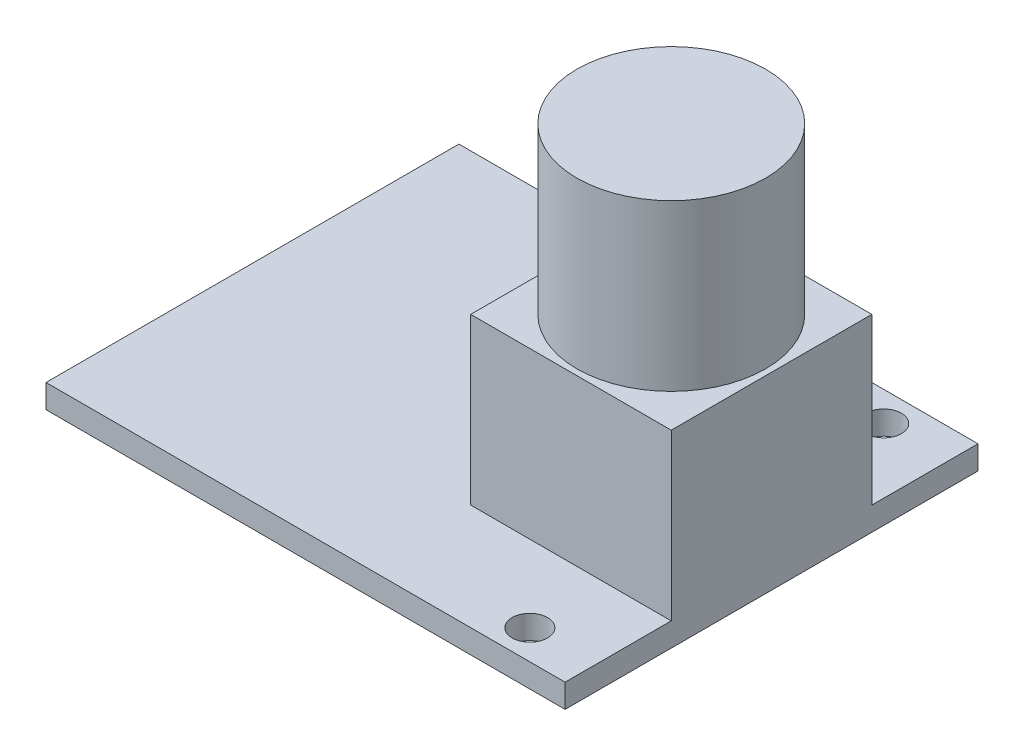
ISO-10303-21;
HEADER;
FILE_DESCRIPTION(('STEP AP214'),'2;1');
FILE_NAME('part.step','',(''),(''),'','','');
FILE_SCHEMA(('AUTOMOTIVE_DESIGN { 1 0 10303 214 1 1 1 1 }'));
ENDSEC;
DATA;
#1=APPLICATION_CONTEXT('core data for automotive mechanical design processes');
#2=APPLICATION_PROTOCOL_DEFINITION('international standard','automotive_design',2000,#1);
#3=PRODUCT_CONTEXT('',#1,'mechanical');
#4=PRODUCT('Part','Part','',(#3));
#5=PRODUCT_RELATED_PRODUCT_CATEGORY('part','',(#4));
#6=PRODUCT_DEFINITION_FORMATION('','',#4);
#7=PRODUCT_DEFINITION_CONTEXT('part definition',#1,'design');
#8=PRODUCT_DEFINITION('design','',#6,#7);
#9=PRODUCT_DEFINITION_SHAPE('','',#8);
#10=(LENGTH_UNIT() NAMED_UNIT(*) SI_UNIT(.MILLI.,.METRE.));
#11=(NAMED_UNIT(*) PLANE_ANGLE_UNIT() SI_UNIT($,.RADIAN.));
#12=(NAMED_UNIT(*) SI_UNIT($,.STERADIAN.) SOLID_ANGLE_UNIT());
#13=UNCERTAINTY_MEASURE_WITH_UNIT(LENGTH_MEASURE(1.E-05),#10,'distance_accuracy_value','');
#14=(GEOMETRIC_REPRESENTATION_CONTEXT(3) GLOBAL_UNCERTAINTY_ASSIGNED_CONTEXT((#13)) GLOBAL_UNIT_ASSIGNED_CONTEXT((#10,
#11,#12)) REPRESENTATION_CONTEXT('',''));
#15=CARTESIAN_POINT('',(0.,0.,0.));
#16=DIRECTION('',(0.,0.,1.));
#17=DIRECTION('',(1.,0.,0.));
#18=AXIS2_PLACEMENT_3D('',#15,#16,#17);
#19=CARTESIAN_POINT('',(22.,2.,-17.5));
#20=DIRECTION('',(-1.,0.,0.));
#21=DIRECTION('',(0.,0.,1.));
#22=AXIS2_PLACEMENT_3D('',#19,#20,#21);
#23=PLANE('',#22);
#24=DIRECTION('',(0.,0.,-1.));
#25=VECTOR('',#24,1.);
#26=CARTESIAN_POINT('',(22.,0.,-17.5));
#27=LINE('',#26,#25);
#28=CARTESIAN_POINT('',(22.,0.,17.5));
#29=VERTEX_POINT('',#28);
#30=CARTESIAN_POINT('',(22.,0.,-17.5));
#31=VERTEX_POINT('',#30);
#32=EDGE_CURVE('E137',#29,#31,#27,.T.);
#33=ORIENTED_EDGE('',*,*,#32,.T.);
#34=DIRECTION('',(0.,-1.,0.));
#35=VECTOR('',#34,1.);
#36=CARTESIAN_POINT('',(22.,2.,-17.5));
#37=LINE('',#36,#35);
#38=CARTESIAN_POINT('',(22.,2.,-17.5));
#39=VERTEX_POINT('',#38);
#40=EDGE_CURVE('E45',#39,#31,#37,.T.);
#41=ORIENTED_EDGE('',*,*,#40,.F.);
#42=DIRECTION('',(0.,0.,-1.));
#43=VECTOR('',#42,1.);
#44=CARTESIAN_POINT('',(22.,2.,-17.5));
#45=LINE('',#44,#43);
#46=CARTESIAN_POINT('',(22.,2.,-8.5));
#47=VERTEX_POINT('',#46);
#48=EDGE_CURVE('E93',#47,#39,#45,.T.);
#49=ORIENTED_EDGE('',*,*,#48,.F.);
#50=DIRECTION('',(0.,-1.,0.));
#51=VECTOR('',#50,1.);
#52=CARTESIAN_POINT('',(22.,16.,-8.5));
#53=LINE('',#52,#51);
#54=CARTESIAN_POINT('',(22.,16.,-8.5));
#55=VERTEX_POINT('',#54);
#56=EDGE_CURVE('E57',#55,#47,#53,.T.);
#57=ORIENTED_EDGE('',*,*,#56,.F.);
#58=DIRECTION('',(0.,0.,1.));
#59=VECTOR('',#58,1.);
#60=CARTESIAN_POINT('',(22.,16.,-8.5));
#61=LINE('',#60,#59);
#62=CARTESIAN_POINT('',(22.,16.,8.5));
#63=VERTEX_POINT('',#62);
#64=EDGE_CURVE('E122',#55,#63,#61,.T.);
#65=ORIENTED_EDGE('',*,*,#64,.T.);
#66=DIRECTION('',(0.,-1.,0.));
#67=VECTOR('',#66,1.);
#68=CARTESIAN_POINT('',(22.,16.,8.5));
#69=LINE('',#68,#67);
#70=CARTESIAN_POINT('',(22.,2.,8.5));
#71=VERTEX_POINT('',#70);
#72=EDGE_CURVE('E131',#63,#71,#69,.T.);
#73=ORIENTED_EDGE('',*,*,#72,.T.);
#74=CARTESIAN_POINT('',(22.,2.,17.5));
#75=VERTEX_POINT('',#74);
#76=EDGE_CURVE('E155',#75,#71,#45,.T.);
#77=ORIENTED_EDGE('',*,*,#76,.F.);
#78=DIRECTION('',(0.,-1.,0.));
#79=VECTOR('',#78,1.);
#80=CARTESIAN_POINT('',(22.,2.,17.5));
#81=LINE('',#80,#79);
#82=EDGE_CURVE('E162',#75,#29,#81,.T.);
#83=ORIENTED_EDGE('',*,*,#82,.T.);
#84=EDGE_LOOP('',(#33,#41,#49,#57,#65,#73,#77,#83));
#85=FACE_BOUND('',#84,.T.);
#86=ADVANCED_FACE('F42',(#85),#23,.F.);
#87=CARTESIAN_POINT('',(-22.,2.,-17.5));
#88=DIRECTION('',(0.,0.,1.));
#89=DIRECTION('',(1.,0.,0.));
#90=AXIS2_PLACEMENT_3D('',#87,#88,#89);
#91=PLANE('',#90);
#92=DIRECTION('',(-1.,0.,0.));
#93=VECTOR('',#92,1.);
#94=CARTESIAN_POINT('',(-22.,0.,-17.5));
#95=LINE('',#94,#93);
#96=CARTESIAN_POINT('',(-22.,0.,-17.5));
#97=VERTEX_POINT('',#96);
#98=EDGE_CURVE('E164',#31,#97,#95,.T.);
#99=ORIENTED_EDGE('',*,*,#98,.T.);
#100=DIRECTION('',(0.,-1.,0.));
#101=VECTOR('',#100,1.);
#102=CARTESIAN_POINT('',(-22.,2.,-17.5));
#103=LINE('',#102,#101);
#104=CARTESIAN_POINT('',(-22.,2.,-17.5));
#105=VERTEX_POINT('',#104);
#106=EDGE_CURVE('E171',#105,#97,#103,.T.);
#107=ORIENTED_EDGE('',*,*,#106,.F.);
#108=DIRECTION('',(-1.,0.,0.));
#109=VECTOR('',#108,1.);
#110=CARTESIAN_POINT('',(-22.,2.,-17.5));
#111=LINE('',#110,#109);
#112=EDGE_CURVE('E157',#39,#105,#111,.T.);
#113=ORIENTED_EDGE('',*,*,#112,.F.);
#114=ORIENTED_EDGE('',*,*,#40,.T.);
#115=EDGE_LOOP('',(#99,#107,#113,#114));
#116=FACE_BOUND('',#115,.T.);
#117=ADVANCED_FACE('F180',(#116),#91,.F.);
#118=CARTESIAN_POINT('',(-22.,2.,-17.5));
#119=DIRECTION('',(1.,0.,0.));
#120=DIRECTION('',(0.,0.,-1.));
#121=AXIS2_PLACEMENT_3D('',#118,#119,#120);
#122=PLANE('',#121);
#123=DIRECTION('',(0.,0.,1.));
#124=VECTOR('',#123,1.);
#125=CARTESIAN_POINT('',(-22.,0.,-17.5));
#126=LINE('',#125,#124);
#127=CARTESIAN_POINT('',(-22.,0.,17.5));
#128=VERTEX_POINT('',#127);
#129=EDGE_CURVE('E166',#97,#128,#126,.T.);
#130=ORIENTED_EDGE('',*,*,#129,.T.);
#131=DIRECTION('',(0.,-1.,0.));
#132=VECTOR('',#131,1.);
#133=CARTESIAN_POINT('',(-22.,2.,17.5));
#134=LINE('',#133,#132);
#135=CARTESIAN_POINT('',(-22.,2.,17.5));
#136=VERTEX_POINT('',#135);
#137=EDGE_CURVE('E170',#136,#128,#134,.T.);
#138=ORIENTED_EDGE('',*,*,#137,.F.);
#139=DIRECTION('',(0.,0.,1.));
#140=VECTOR('',#139,1.);
#141=CARTESIAN_POINT('',(-22.,2.,-17.5));
#142=LINE('',#141,#140);
#143=EDGE_CURVE('E159',#105,#136,#142,.T.);
#144=ORIENTED_EDGE('',*,*,#143,.F.);
#145=ORIENTED_EDGE('',*,*,#106,.T.);
#146=EDGE_LOOP('',(#130,#138,#144,#145));
#147=FACE_BOUND('',#146,.T.);
#148=ADVANCED_FACE('F185',(#147),#122,.F.);
#149=CARTESIAN_POINT('',(-22.,2.,17.5));
#150=DIRECTION('',(0.,0.,-1.));
#151=DIRECTION('',(-1.,0.,0.));
#152=AXIS2_PLACEMENT_3D('',#149,#150,#151);
#153=PLANE('',#152);
#154=DIRECTION('',(1.,0.,0.));
#155=VECTOR('',#154,1.);
#156=CARTESIAN_POINT('',(-22.,0.,17.5));
#157=LINE('',#156,#155);
#158=EDGE_CURVE('E87',#128,#29,#157,.T.);
#159=ORIENTED_EDGE('',*,*,#158,.T.);
#160=ORIENTED_EDGE('',*,*,#82,.F.);
#161=DIRECTION('',(1.,0.,0.));
#162=VECTOR('',#161,1.);
#163=CARTESIAN_POINT('',(-22.,2.,17.5));
#164=LINE('',#163,#162);
#165=EDGE_CURVE('E66',#136,#75,#164,.T.);
#166=ORIENTED_EDGE('',*,*,#165,.F.);
#167=ORIENTED_EDGE('',*,*,#137,.T.);
#168=EDGE_LOOP('',(#159,#160,#166,#167));
#169=FACE_BOUND('',#168,.T.);
#170=ADVANCED_FACE('F186',(#169),#153,.F.);
#171=CARTESIAN_POINT('',(0.,2.,0.));
#172=DIRECTION('',(0.,1.,0.));
#173=DIRECTION('',(0.,0.,1.));
#174=AXIS2_PLACEMENT_3D('',#171,#172,#173);
#175=PLANE('',#174);
#176=CARTESIAN_POINT('',(16.5115749990888,2.,-15.));
#177=DIRECTION('',(0.,1.,0.));
#178=DIRECTION('',(0.,0.,1.));
#179=AXIS2_PLACEMENT_3D('',#176,#177,#178);
#180=CIRCLE('',#179,1.5);
#181=CARTESIAN_POINT('',(16.5115749990888,2.,-13.5));
#182=VERTEX_POINT('',#181);
#183=EDGE_CURVE('E221',#182,#182,#180,.T.);
#184=ORIENTED_EDGE('',*,*,#183,.F.);
#185=EDGE_LOOP('',(#184));
#186=FACE_BOUND('',#185,.T.);
#187=CARTESIAN_POINT('',(16.5115749990888,2.,15.));
#188=DIRECTION('',(0.,1.,0.));
#189=DIRECTION('',(0.,0.,1.));
#190=AXIS2_PLACEMENT_3D('',#187,#188,#189);
#191=CIRCLE('',#190,1.5);
#192=CARTESIAN_POINT('',(16.5115749990888,2.,16.5));
#193=VERTEX_POINT('',#192);
#194=EDGE_CURVE('E224',#193,#193,#191,.T.);
#195=ORIENTED_EDGE('',*,*,#194,.F.);
#196=EDGE_LOOP('',(#195));
#197=FACE_BOUND('',#196,.T.);
#198=DIRECTION('',(1.,0.,0.));
#199=VECTOR('',#198,1.);
#200=CARTESIAN_POINT('',(5.,2.,8.5));
#201=LINE('',#200,#199);
#202=CARTESIAN_POINT('',(5.,2.,8.5));
#203=VERTEX_POINT('',#202);
#204=EDGE_CURVE('E134',#203,#71,#201,.T.);
#205=ORIENTED_EDGE('',*,*,#204,.F.);
#206=DIRECTION('',(0.,0.,1.));
#207=VECTOR('',#206,1.);
#208=CARTESIAN_POINT('',(5.,2.,-8.5));
#209=LINE('',#208,#207);
#210=CARTESIAN_POINT('',(5.,2.,-8.5));
#211=VERTEX_POINT('',#210);
#212=EDGE_CURVE('E128',#211,#203,#209,.T.);
#213=ORIENTED_EDGE('',*,*,#212,.F.);
#214=DIRECTION('',(1.,0.,0.));
#215=VECTOR('',#214,1.);
#216=CARTESIAN_POINT('',(5.,2.,-8.5));
#217=LINE('',#216,#215);
#218=EDGE_CURVE('E147',#211,#47,#217,.T.);
#219=ORIENTED_EDGE('',*,*,#218,.T.);
#220=ORIENTED_EDGE('',*,*,#48,.T.);
#221=ORIENTED_EDGE('',*,*,#112,.T.);
#222=ORIENTED_EDGE('',*,*,#143,.T.);
#223=ORIENTED_EDGE('',*,*,#165,.T.);
#224=ORIENTED_EDGE('',*,*,#76,.T.);
#225=EDGE_LOOP('',(#205,#213,#219,#220,#221,#222,#223,#224));
#226=FACE_BOUND('',#225,.T.);
#227=ADVANCED_FACE('F187',(#186,#197,#226),#175,.T.);
#228=CARTESIAN_POINT('',(0.,0.,0.));
#229=DIRECTION('',(0.,1.,0.));
#230=DIRECTION('',(0.,0.,1.));
#231=AXIS2_PLACEMENT_3D('',#228,#229,#230);
#232=PLANE('',#231);
#233=CARTESIAN_POINT('',(16.5115749990888,0.,-15.));
#234=DIRECTION('',(0.,-1.,0.));
#235=DIRECTION('',(0.,0.,-1.));
#236=AXIS2_PLACEMENT_3D('',#233,#234,#235);
#237=CIRCLE('',#236,1.5);
#238=CARTESIAN_POINT('',(16.5115749990888,0.,-16.5));
#239=VERTEX_POINT('',#238);
#240=EDGE_CURVE('E226',#239,#239,#237,.T.);
#241=ORIENTED_EDGE('',*,*,#240,.F.);
#242=EDGE_LOOP('',(#241));
#243=FACE_BOUND('',#242,.T.);
#244=CARTESIAN_POINT('',(16.5115749990888,0.,15.));
#245=DIRECTION('',(0.,-1.,0.));
#246=DIRECTION('',(0.,0.,1.));
#247=AXIS2_PLACEMENT_3D('',#244,#245,#246);
#248=CIRCLE('',#247,1.5);
#249=CARTESIAN_POINT('',(16.5115749990888,0.,16.5));
#250=VERTEX_POINT('',#249);
#251=EDGE_CURVE('E230',#250,#250,#248,.T.);
#252=ORIENTED_EDGE('',*,*,#251,.F.);
#253=EDGE_LOOP('',(#252));
#254=FACE_BOUND('',#253,.T.);
#255=ORIENTED_EDGE('',*,*,#32,.F.);
#256=ORIENTED_EDGE('',*,*,#158,.F.);
#257=ORIENTED_EDGE('',*,*,#129,.F.);
#258=ORIENTED_EDGE('',*,*,#98,.F.);
#259=EDGE_LOOP('',(#255,#256,#257,#258));
#260=FACE_BOUND('',#259,.T.);
#261=ADVANCED_FACE('F183',(#243,#254,#260),#232,.F.);
#262=CARTESIAN_POINT('',(5.,16.,8.5));
#263=DIRECTION('',(0.,0.,-1.));
#264=DIRECTION('',(-1.,0.,0.));
#265=AXIS2_PLACEMENT_3D('',#262,#263,#264);
#266=PLANE('',#265);
#267=ORIENTED_EDGE('',*,*,#204,.T.);
#268=ORIENTED_EDGE('',*,*,#72,.F.);
#269=DIRECTION('',(1.,0.,0.));
#270=VECTOR('',#269,1.);
#271=CARTESIAN_POINT('',(5.,16.,8.5));
#272=LINE('',#271,#270);
#273=CARTESIAN_POINT('',(5.,16.,8.5));
#274=VERTEX_POINT('',#273);
#275=EDGE_CURVE('E117',#274,#63,#272,.T.);
#276=ORIENTED_EDGE('',*,*,#275,.F.);
#277=DIRECTION('',(0.,-1.,0.));
#278=VECTOR('',#277,1.);
#279=CARTESIAN_POINT('',(5.,16.,8.5));
#280=LINE('',#279,#278);
#281=EDGE_CURVE('E145',#274,#203,#280,.T.);
#282=ORIENTED_EDGE('',*,*,#281,.T.);
#283=EDGE_LOOP('',(#267,#268,#276,#282));
#284=FACE_BOUND('',#283,.T.);
#285=ADVANCED_FACE('F132',(#284),#266,.F.);
#286=CARTESIAN_POINT('',(5.,16.,-8.5));
#287=DIRECTION('',(0.,0.,-1.));
#288=DIRECTION('',(-1.,0.,0.));
#289=AXIS2_PLACEMENT_3D('',#286,#287,#288);
#290=PLANE('',#289);
#291=ORIENTED_EDGE('',*,*,#218,.F.);
#292=DIRECTION('',(0.,-1.,0.));
#293=VECTOR('',#292,1.);
#294=CARTESIAN_POINT('',(5.,16.,-8.5));
#295=LINE('',#294,#293);
#296=CARTESIAN_POINT('',(5.,16.,-8.5));
#297=VERTEX_POINT('',#296);
#298=EDGE_CURVE('E152',#297,#211,#295,.T.);
#299=ORIENTED_EDGE('',*,*,#298,.F.);
#300=DIRECTION('',(1.,0.,0.));
#301=VECTOR('',#300,1.);
#302=CARTESIAN_POINT('',(5.,16.,-8.5));
#303=LINE('',#302,#301);
#304=EDGE_CURVE('E140',#297,#55,#303,.T.);
#305=ORIENTED_EDGE('',*,*,#304,.T.);
#306=ORIENTED_EDGE('',*,*,#56,.T.);
#307=EDGE_LOOP('',(#291,#299,#305,#306));
#308=FACE_BOUND('',#307,.T.);
#309=ADVANCED_FACE('F191',(#308),#290,.T.);
#310=CARTESIAN_POINT('',(5.,16.,-8.5));
#311=DIRECTION('',(1.,0.,0.));
#312=DIRECTION('',(0.,0.,-1.));
#313=AXIS2_PLACEMENT_3D('',#310,#311,#312);
#314=PLANE('',#313);
#315=ORIENTED_EDGE('',*,*,#212,.T.);
#316=ORIENTED_EDGE('',*,*,#281,.F.);
#317=DIRECTION('',(0.,0.,1.));
#318=VECTOR('',#317,1.);
#319=CARTESIAN_POINT('',(5.,16.,-8.5));
#320=LINE('',#319,#318);
#321=EDGE_CURVE('E124',#297,#274,#320,.T.);
#322=ORIENTED_EDGE('',*,*,#321,.F.);
#323=ORIENTED_EDGE('',*,*,#298,.T.);
#324=EDGE_LOOP('',(#315,#316,#322,#323));
#325=FACE_BOUND('',#324,.T.);
#326=ADVANCED_FACE('F190',(#325),#314,.F.);
#327=CARTESIAN_POINT('',(0.,16.,0.));
#328=DIRECTION('',(0.,-1.,0.));
#329=DIRECTION('',(0.,0.,-1.));
#330=AXIS2_PLACEMENT_3D('',#327,#328,#329);
#331=PLANE('',#330);
#332=CARTESIAN_POINT('',(13.5,16.,0.));
#333=DIRECTION('',(0.,1.,0.));
#334=DIRECTION('',(0.,0.,1.));
#335=AXIS2_PLACEMENT_3D('',#332,#333,#334);
#336=CIRCLE('',#335,8.);
#337=CARTESIAN_POINT('',(13.5,16.,8.));
#338=VERTEX_POINT('',#337);
#339=EDGE_CURVE('E11',#338,#338,#336,.T.);
#340=ORIENTED_EDGE('',*,*,#339,.F.);
#341=EDGE_LOOP('',(#340));
#342=FACE_BOUND('',#341,.T.);
#343=ORIENTED_EDGE('',*,*,#275,.T.);
#344=ORIENTED_EDGE('',*,*,#64,.F.);
#345=ORIENTED_EDGE('',*,*,#304,.F.);
#346=ORIENTED_EDGE('',*,*,#321,.T.);
#347=EDGE_LOOP('',(#343,#344,#345,#346));
#348=FACE_BOUND('',#347,.T.);
#349=ADVANCED_FACE('F119',(#342,#348),#331,.F.);
#350=CARTESIAN_POINT('',(13.5,30.,0.));
#351=DIRECTION('',(0.,-1.,0.));
#352=DIRECTION('',(0.,0.,-1.));
#353=AXIS2_PLACEMENT_3D('',#350,#351,#352);
#354=CYLINDRICAL_SURFACE('',#353,8.);
#355=CARTESIAN_POINT('',(13.5,30.,0.));
#356=DIRECTION('',(0.,1.,0.));
#357=DIRECTION('',(0.,0.,1.));
#358=AXIS2_PLACEMENT_3D('',#355,#356,#357);
#359=CIRCLE('',#358,8.);
#360=CARTESIAN_POINT('',(13.5,30.,8.));
#361=VERTEX_POINT('',#360);
#362=EDGE_CURVE('E148',#361,#361,#359,.T.);
#363=ORIENTED_EDGE('',*,*,#362,.F.);
#364=EDGE_LOOP('',(#363));
#365=FACE_BOUND('',#364,.T.);
#366=ORIENTED_EDGE('',*,*,#339,.T.);
#367=EDGE_LOOP('',(#366));
#368=FACE_BOUND('',#367,.T.);
#369=ADVANCED_FACE('F239',(#365,#368),#354,.T.);
#370=CARTESIAN_POINT('',(13.5,30.,0.));
#371=DIRECTION('',(0.,1.,0.));
#372=DIRECTION('',(0.,0.,1.));
#373=AXIS2_PLACEMENT_3D('',#370,#371,#372);
#374=PLANE('',#373);
#375=ORIENTED_EDGE('',*,*,#362,.T.);
#376=EDGE_LOOP('',(#375));
#377=FACE_BOUND('',#376,.T.);
#378=ADVANCED_FACE('F237',(#377),#374,.T.);
#379=CARTESIAN_POINT('',(16.5115749990888,10.,15.));
#380=DIRECTION('',(0.,-1.,0.));
#381=DIRECTION('',(0.,0.,-1.));
#382=AXIS2_PLACEMENT_3D('',#379,#380,#381);
#383=CYLINDRICAL_SURFACE('',#382,1.5);
#384=ORIENTED_EDGE('',*,*,#194,.T.);
#385=EDGE_LOOP('',(#384));
#386=FACE_BOUND('',#385,.T.);
#387=ORIENTED_EDGE('',*,*,#251,.T.);
#388=EDGE_LOOP('',(#387));
#389=FACE_BOUND('',#388,.T.);
#390=ADVANCED_FACE('F252',(#386,#389),#383,.F.);
#391=CARTESIAN_POINT('',(16.5115749990888,10.,-15.));
#392=DIRECTION('',(0.,-1.,0.));
#393=DIRECTION('',(0.,0.,-1.));
#394=AXIS2_PLACEMENT_3D('',#391,#392,#393);
#395=CYLINDRICAL_SURFACE('',#394,1.5);
#396=ORIENTED_EDGE('',*,*,#183,.T.);
#397=EDGE_LOOP('',(#396));
#398=FACE_BOUND('',#397,.T.);
#399=ORIENTED_EDGE('',*,*,#240,.T.);
#400=EDGE_LOOP('',(#399));
#401=FACE_BOUND('',#400,.T.);
#402=ADVANCED_FACE('F255',(#398,#401),#395,.F.);
#403=CLOSED_SHELL('',(#86,#117,#148,#170,#227,#261,#285,#309,#326,#349,#369,#378,#390,#402));
#404=MANIFOLD_SOLID_BREP('B2',#403);
#405=ADVANCED_BREP_SHAPE_REPRESENTATION('',(#18,#404),#14);
#406=SHAPE_DEFINITION_REPRESENTATION(#9,#405);
ENDSEC;
END-ISO-10303-21;
